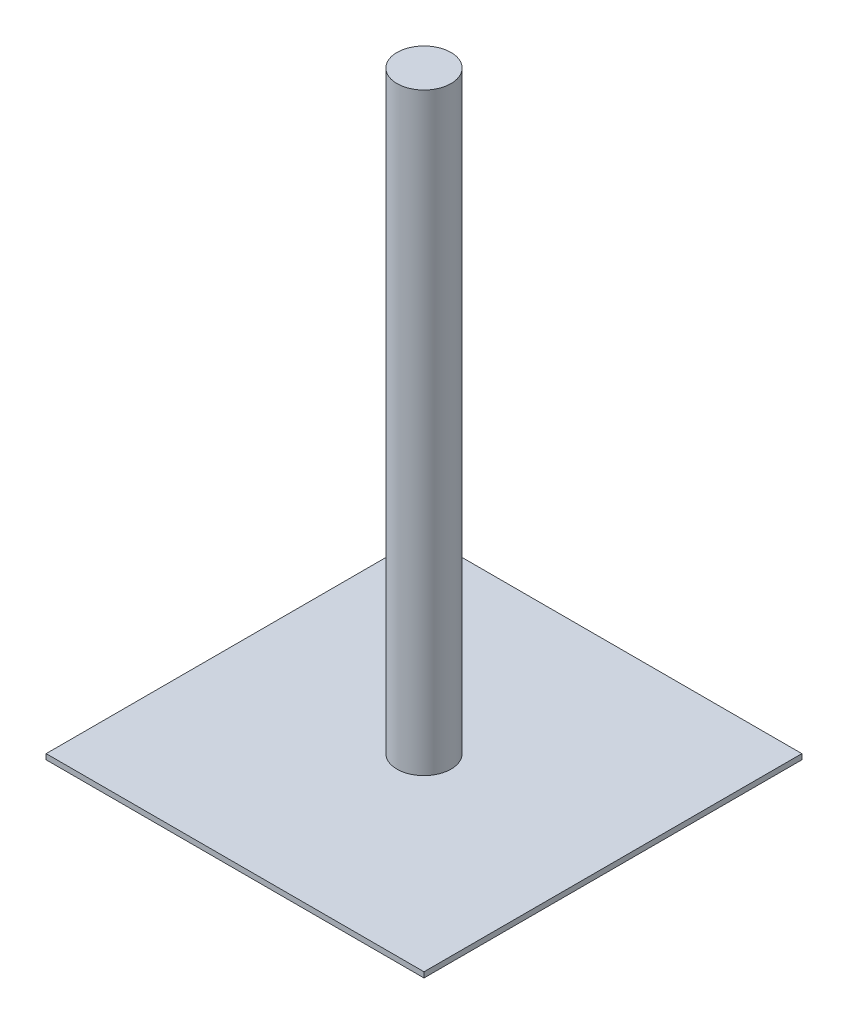
ISO-10303-21;
HEADER;
FILE_DESCRIPTION(('STEP AP214'),'2;1');
FILE_NAME('part.step','',(''),(''),'','','');
FILE_SCHEMA(('AUTOMOTIVE_DESIGN { 1 0 10303 214 1 1 1 1 }'));
ENDSEC;
DATA;
#1=APPLICATION_CONTEXT('core data for automotive mechanical design processes');
#2=APPLICATION_PROTOCOL_DEFINITION('international standard','automotive_design',2000,#1);
#3=PRODUCT_CONTEXT('',#1,'mechanical');
#4=PRODUCT('Part','Part','',(#3));
#5=PRODUCT_RELATED_PRODUCT_CATEGORY('part','',(#4));
#6=PRODUCT_DEFINITION_FORMATION('','',#4);
#7=PRODUCT_DEFINITION_CONTEXT('part definition',#1,'design');
#8=PRODUCT_DEFINITION('design','',#6,#7);
#9=PRODUCT_DEFINITION_SHAPE('','',#8);
#10=(LENGTH_UNIT() NAMED_UNIT(*) SI_UNIT(.MILLI.,.METRE.));
#11=(NAMED_UNIT(*) PLANE_ANGLE_UNIT() SI_UNIT($,.RADIAN.));
#12=(NAMED_UNIT(*) SI_UNIT($,.STERADIAN.) SOLID_ANGLE_UNIT());
#13=UNCERTAINTY_MEASURE_WITH_UNIT(LENGTH_MEASURE(1.E-05),#10,'distance_accuracy_value','');
#14=(GEOMETRIC_REPRESENTATION_CONTEXT(3) GLOBAL_UNCERTAINTY_ASSIGNED_CONTEXT((#13)) GLOBAL_UNIT_ASSIGNED_CONTEXT((#10,
#11,#12)) REPRESENTATION_CONTEXT('',''));
#15=CARTESIAN_POINT('',(0.,0.,0.));
#16=DIRECTION('',(0.,0.,1.));
#17=DIRECTION('',(1.,0.,0.));
#18=AXIS2_PLACEMENT_3D('',#15,#16,#17);
#19=CARTESIAN_POINT('',(350.,10.,350.));
#20=DIRECTION('',(-1.,0.,0.));
#21=DIRECTION('',(0.,0.,1.));
#22=AXIS2_PLACEMENT_3D('',#19,#20,#21);
#23=PLANE('',#22);
#24=DIRECTION('',(0.,0.,-1.));
#25=VECTOR('',#24,1.);
#26=CARTESIAN_POINT('',(350.,0.,350.));
#27=LINE('',#26,#25);
#28=CARTESIAN_POINT('',(350.,0.,350.));
#29=VERTEX_POINT('',#28);
#30=CARTESIAN_POINT('',(350.,0.,-350.));
#31=VERTEX_POINT('',#30);
#32=EDGE_CURVE('E110',#29,#31,#27,.T.);
#33=ORIENTED_EDGE('',*,*,#32,.T.);
#34=DIRECTION('',(0.,-1.,0.));
#35=VECTOR('',#34,1.);
#36=CARTESIAN_POINT('',(350.,10.,-350.));
#37=LINE('',#36,#35);
#38=CARTESIAN_POINT('',(350.,10.,-350.));
#39=VERTEX_POINT('',#38);
#40=EDGE_CURVE('E48',#39,#31,#37,.T.);
#41=ORIENTED_EDGE('',*,*,#40,.F.);
#42=DIRECTION('',(0.,0.,-1.));
#43=VECTOR('',#42,1.);
#44=CARTESIAN_POINT('',(350.,10.,350.));
#45=LINE('',#44,#43);
#46=CARTESIAN_POINT('',(350.,10.,350.));
#47=VERTEX_POINT('',#46);
#48=EDGE_CURVE('E92',#47,#39,#45,.T.);
#49=ORIENTED_EDGE('',*,*,#48,.F.);
#50=DIRECTION('',(0.,-1.,0.));
#51=VECTOR('',#50,1.);
#52=CARTESIAN_POINT('',(350.,10.,350.));
#53=LINE('',#52,#51);
#54=EDGE_CURVE('E106',#47,#29,#53,.T.);
#55=ORIENTED_EDGE('',*,*,#54,.T.);
#56=EDGE_LOOP('',(#33,#41,#49,#55));
#57=FACE_BOUND('',#56,.T.);
#58=ADVANCED_FACE('F39',(#57),#23,.F.);
#59=CARTESIAN_POINT('',(-350.,10.,-350.));
#60=DIRECTION('',(0.,0.,1.));
#61=DIRECTION('',(1.,0.,0.));
#62=AXIS2_PLACEMENT_3D('',#59,#60,#61);
#63=PLANE('',#62);
#64=DIRECTION('',(-1.,0.,0.));
#65=VECTOR('',#64,1.);
#66=CARTESIAN_POINT('',(-350.,0.,-350.));
#67=LINE('',#66,#65);
#68=CARTESIAN_POINT('',(-350.,0.,-350.));
#69=VERTEX_POINT('',#68);
#70=EDGE_CURVE('E98',#31,#69,#67,.T.);
#71=ORIENTED_EDGE('',*,*,#70,.T.);
#72=DIRECTION('',(0.,-1.,0.));
#73=VECTOR('',#72,1.);
#74=CARTESIAN_POINT('',(-350.,10.,-350.));
#75=LINE('',#74,#73);
#76=CARTESIAN_POINT('',(-350.,10.,-350.));
#77=VERTEX_POINT('',#76);
#78=EDGE_CURVE('E96',#77,#69,#75,.T.);
#79=ORIENTED_EDGE('',*,*,#78,.F.);
#80=DIRECTION('',(-1.,0.,0.));
#81=VECTOR('',#80,1.);
#82=CARTESIAN_POINT('',(-350.,10.,-350.));
#83=LINE('',#82,#81);
#84=EDGE_CURVE('E87',#39,#77,#83,.T.);
#85=ORIENTED_EDGE('',*,*,#84,.F.);
#86=ORIENTED_EDGE('',*,*,#40,.T.);
#87=EDGE_LOOP('',(#71,#79,#85,#86));
#88=FACE_BOUND('',#87,.T.);
#89=ADVANCED_FACE('F97',(#88),#63,.F.);
#90=CARTESIAN_POINT('',(-350.,10.,350.));
#91=DIRECTION('',(1.,0.,0.));
#92=DIRECTION('',(0.,0.,-1.));
#93=AXIS2_PLACEMENT_3D('',#90,#91,#92);
#94=PLANE('',#93);
#95=DIRECTION('',(0.,0.,1.));
#96=VECTOR('',#95,1.);
#97=CARTESIAN_POINT('',(-350.,0.,350.));
#98=LINE('',#97,#96);
#99=CARTESIAN_POINT('',(-350.,0.,350.));
#100=VERTEX_POINT('',#99);
#101=EDGE_CURVE('E73',#69,#100,#98,.T.);
#102=ORIENTED_EDGE('',*,*,#101,.T.);
#103=DIRECTION('',(0.,-1.,0.));
#104=VECTOR('',#103,1.);
#105=CARTESIAN_POINT('',(-350.,10.,350.));
#106=LINE('',#105,#104);
#107=CARTESIAN_POINT('',(-350.,10.,350.));
#108=VERTEX_POINT('',#107);
#109=EDGE_CURVE('E100',#108,#100,#106,.T.);
#110=ORIENTED_EDGE('',*,*,#109,.F.);
#111=DIRECTION('',(0.,0.,1.));
#112=VECTOR('',#111,1.);
#113=CARTESIAN_POINT('',(-350.,10.,350.));
#114=LINE('',#113,#112);
#115=EDGE_CURVE('E90',#77,#108,#114,.T.);
#116=ORIENTED_EDGE('',*,*,#115,.F.);
#117=ORIENTED_EDGE('',*,*,#78,.T.);
#118=EDGE_LOOP('',(#102,#110,#116,#117));
#119=FACE_BOUND('',#118,.T.);
#120=ADVANCED_FACE('F102',(#119),#94,.F.);
#121=CARTESIAN_POINT('',(-350.,10.,350.));
#122=DIRECTION('',(0.,0.,-1.));
#123=DIRECTION('',(-1.,0.,0.));
#124=AXIS2_PLACEMENT_3D('',#121,#122,#123);
#125=PLANE('',#124);
#126=DIRECTION('',(1.,0.,0.));
#127=VECTOR('',#126,1.);
#128=CARTESIAN_POINT('',(-350.,0.,350.));
#129=LINE('',#128,#127);
#130=EDGE_CURVE('E79',#100,#29,#129,.T.);
#131=ORIENTED_EDGE('',*,*,#130,.T.);
#132=ORIENTED_EDGE('',*,*,#54,.F.);
#133=DIRECTION('',(1.,0.,0.));
#134=VECTOR('',#133,1.);
#135=CARTESIAN_POINT('',(-350.,10.,350.));
#136=LINE('',#135,#134);
#137=EDGE_CURVE('E56',#108,#47,#136,.T.);
#138=ORIENTED_EDGE('',*,*,#137,.F.);
#139=ORIENTED_EDGE('',*,*,#109,.T.);
#140=EDGE_LOOP('',(#131,#132,#138,#139));
#141=FACE_BOUND('',#140,.T.);
#142=ADVANCED_FACE('F139',(#141),#125,.F.);
#143=CARTESIAN_POINT('',(0.,10.,0.));
#144=DIRECTION('',(0.,-1.,0.));
#145=DIRECTION('',(0.,0.,-1.));
#146=AXIS2_PLACEMENT_3D('',#143,#144,#145);
#147=PLANE('',#146);
#148=CARTESIAN_POINT('',(0.,10.,0.));
#149=DIRECTION('',(0.,-1.,0.));
#150=DIRECTION('',(0.,0.,-1.));
#151=AXIS2_PLACEMENT_3D('',#148,#149,#150);
#152=CIRCLE('',#151,50.);
#153=CARTESIAN_POINT('',(0.,10.,-50.));
#154=VERTEX_POINT('',#153);
#155=EDGE_CURVE('E11',#154,#154,#152,.F.);
#156=ORIENTED_EDGE('',*,*,#155,.F.);
#157=EDGE_LOOP('',(#156));
#158=FACE_BOUND('',#157,.T.);
#159=ORIENTED_EDGE('',*,*,#48,.T.);
#160=ORIENTED_EDGE('',*,*,#84,.T.);
#161=ORIENTED_EDGE('',*,*,#115,.T.);
#162=ORIENTED_EDGE('',*,*,#137,.T.);
#163=EDGE_LOOP('',(#159,#160,#161,#162));
#164=FACE_BOUND('',#163,.T.);
#165=ADVANCED_FACE('F88',(#158,#164),#147,.F.);
#166=CARTESIAN_POINT('',(0.,0.,0.));
#167=DIRECTION('',(0.,-1.,0.));
#168=DIRECTION('',(0.,0.,-1.));
#169=AXIS2_PLACEMENT_3D('',#166,#167,#168);
#170=PLANE('',#169);
#171=ORIENTED_EDGE('',*,*,#32,.F.);
#172=ORIENTED_EDGE('',*,*,#130,.F.);
#173=ORIENTED_EDGE('',*,*,#101,.F.);
#174=ORIENTED_EDGE('',*,*,#70,.F.);
#175=EDGE_LOOP('',(#171,#172,#173,#174));
#176=FACE_BOUND('',#175,.T.);
#177=ADVANCED_FACE('F128',(#176),#170,.T.);
#178=CARTESIAN_POINT('',(0.,1110.,0.));
#179=DIRECTION('',(0.,-1.,0.));
#180=DIRECTION('',(0.,0.,-1.));
#181=AXIS2_PLACEMENT_3D('',#178,#179,#180);
#182=CYLINDRICAL_SURFACE('',#181,50.);
#183=CARTESIAN_POINT('',(0.,1110.,0.));
#184=DIRECTION('',(0.,1.,0.));
#185=DIRECTION('',(0.,0.,1.));
#186=AXIS2_PLACEMENT_3D('',#183,#184,#185);
#187=CIRCLE('',#186,50.);
#188=CARTESIAN_POINT('',(0.,1110.,50.));
#189=VERTEX_POINT('',#188);
#190=EDGE_CURVE('E114',#189,#189,#187,.T.);
#191=ORIENTED_EDGE('',*,*,#190,.F.);
#192=EDGE_LOOP('',(#191));
#193=FACE_BOUND('',#192,.T.);
#194=ORIENTED_EDGE('',*,*,#155,.T.);
#195=EDGE_LOOP('',(#194));
#196=FACE_BOUND('',#195,.T.);
#197=ADVANCED_FACE('F130',(#193,#196),#182,.T.);
#198=CARTESIAN_POINT('',(0.,1110.,0.));
#199=DIRECTION('',(0.,1.,0.));
#200=DIRECTION('',(0.,0.,1.));
#201=AXIS2_PLACEMENT_3D('',#198,#199,#200);
#202=PLANE('',#201);
#203=ORIENTED_EDGE('',*,*,#190,.T.);
#204=EDGE_LOOP('',(#203));
#205=FACE_BOUND('',#204,.T.);
#206=ADVANCED_FACE('F136',(#205),#202,.T.);
#207=CLOSED_SHELL('',(#58,#89,#120,#142,#165,#177,#197,#206));
#208=MANIFOLD_SOLID_BREP('B2',#207);
#209=ADVANCED_BREP_SHAPE_REPRESENTATION('',(#18,#208),#14);
#210=SHAPE_DEFINITION_REPRESENTATION(#9,#209);
ENDSEC;
END-ISO-10303-21;
